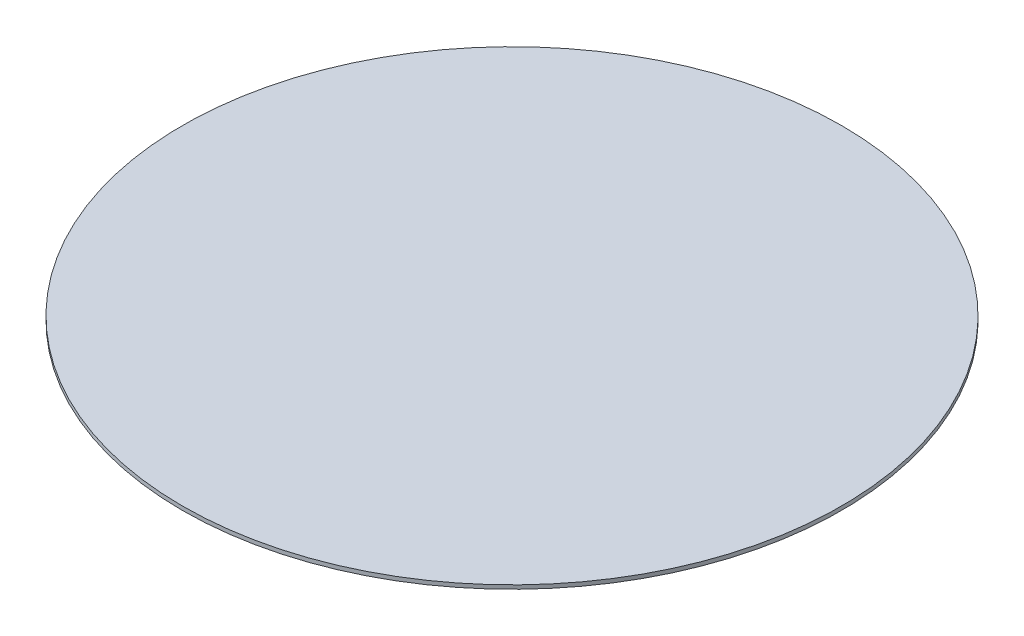
ISO-10303-21;
HEADER;
FILE_DESCRIPTION(('STEP AP214'),'2;1');
FILE_NAME('part.step','',(''),(''),'','','');
FILE_SCHEMA(('AUTOMOTIVE_DESIGN { 1 0 10303 214 1 1 1 1 }'));
ENDSEC;
DATA;
#1=APPLICATION_CONTEXT('core data for automotive mechanical design processes');
#2=APPLICATION_PROTOCOL_DEFINITION('international standard','automotive_design',2000,#1);
#3=PRODUCT_CONTEXT('',#1,'mechanical');
#4=PRODUCT('Part','Part','',(#3));
#5=PRODUCT_RELATED_PRODUCT_CATEGORY('part','',(#4));
#6=PRODUCT_DEFINITION_FORMATION('','',#4);
#7=PRODUCT_DEFINITION_CONTEXT('part definition',#1,'design');
#8=PRODUCT_DEFINITION('design','',#6,#7);
#9=PRODUCT_DEFINITION_SHAPE('','',#8);
#10=(LENGTH_UNIT() NAMED_UNIT(*) SI_UNIT(.MILLI.,.METRE.));
#11=(NAMED_UNIT(*) PLANE_ANGLE_UNIT() SI_UNIT($,.RADIAN.));
#12=(NAMED_UNIT(*) SI_UNIT($,.STERADIAN.) SOLID_ANGLE_UNIT());
#13=UNCERTAINTY_MEASURE_WITH_UNIT(LENGTH_MEASURE(1.E-05),#10,'distance_accuracy_value','');
#14=(GEOMETRIC_REPRESENTATION_CONTEXT(3) GLOBAL_UNCERTAINTY_ASSIGNED_CONTEXT((#13)) GLOBAL_UNIT_ASSIGNED_CONTEXT((#10,
#11,#12)) REPRESENTATION_CONTEXT('',''));
#15=CARTESIAN_POINT('',(0.,0.,0.));
#16=DIRECTION('',(0.,0.,1.));
#17=DIRECTION('',(1.,0.,0.));
#18=AXIS2_PLACEMENT_3D('',#15,#16,#17);
#19=CARTESIAN_POINT('',(0.,0.127,0.));
#20=DIRECTION('',(0.,-1.,0.));
#21=DIRECTION('',(0.,0.,-1.));
#22=AXIS2_PLACEMENT_3D('',#19,#20,#21);
#23=CYLINDRICAL_SURFACE('',#22,10.843749966);
#24=CARTESIAN_POINT('',(0.,0.127,0.));
#25=DIRECTION('',(0.,1.,0.));
#26=DIRECTION('',(0.,0.,1.));
#27=AXIS2_PLACEMENT_3D('',#24,#25,#26);
#28=CIRCLE('',#27,10.843749966);
#29=CARTESIAN_POINT('',(0.,0.127,10.843749966));
#30=VERTEX_POINT('',#29);
#31=EDGE_CURVE('E10',#30,#30,#28,.T.);
#32=ORIENTED_EDGE('',*,*,#31,.F.);
#33=EDGE_LOOP('',(#32));
#34=FACE_BOUND('',#33,.T.);
#35=CARTESIAN_POINT('',(0.,0.,0.));
#36=DIRECTION('',(0.,1.,0.));
#37=DIRECTION('',(0.,0.,1.));
#38=AXIS2_PLACEMENT_3D('',#35,#36,#37);
#39=CIRCLE('',#38,10.843749966);
#40=CARTESIAN_POINT('',(0.,0.,10.843749966));
#41=VERTEX_POINT('',#40);
#42=EDGE_CURVE('E34',#41,#41,#39,.T.);
#43=ORIENTED_EDGE('',*,*,#42,.T.);
#44=EDGE_LOOP('',(#43));
#45=FACE_BOUND('',#44,.T.);
#46=ADVANCED_FACE('F31',(#34,#45),#23,.T.);
#47=CARTESIAN_POINT('',(0.,0.127,0.));
#48=DIRECTION('',(0.,1.,0.));
#49=DIRECTION('',(0.,0.,1.));
#50=AXIS2_PLACEMENT_3D('',#47,#48,#49);
#51=PLANE('',#50);
#52=ORIENTED_EDGE('',*,*,#31,.T.);
#53=EDGE_LOOP('',(#52));
#54=FACE_BOUND('',#53,.T.);
#55=ADVANCED_FACE('F46',(#54),#51,.T.);
#56=CARTESIAN_POINT('',(0.,0.,0.));
#57=DIRECTION('',(0.,1.,0.));
#58=DIRECTION('',(0.,0.,1.));
#59=AXIS2_PLACEMENT_3D('',#56,#57,#58);
#60=PLANE('',#59);
#61=ORIENTED_EDGE('',*,*,#42,.F.);
#62=EDGE_LOOP('',(#61));
#63=FACE_BOUND('',#62,.T.);
#64=ADVANCED_FACE('F44',(#63),#60,.F.);
#65=CLOSED_SHELL('',(#46,#55,#64));
#66=MANIFOLD_SOLID_BREP('B2',#65);
#67=ADVANCED_BREP_SHAPE_REPRESENTATION('',(#18,#66),#14);
#68=SHAPE_DEFINITION_REPRESENTATION(#9,#67);
ENDSEC;
END-ISO-10303-21;
